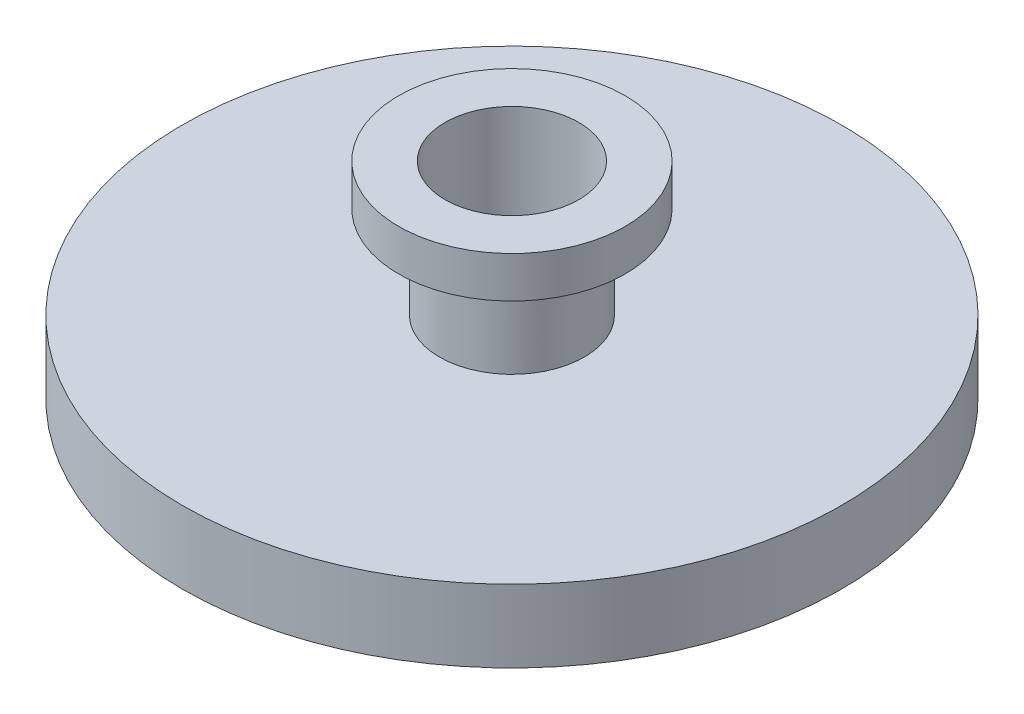
ISO-10303-21;
HEADER;
FILE_DESCRIPTION(('STEP AP214'),'2;1');
FILE_NAME('part.step','',(''),(''),'','','');
FILE_SCHEMA(('AUTOMOTIVE_DESIGN { 1 0 10303 214 1 1 1 1 }'));
ENDSEC;
DATA;
#1=APPLICATION_CONTEXT('core data for automotive mechanical design processes');
#2=APPLICATION_PROTOCOL_DEFINITION('international standard','automotive_design',2000,#1);
#3=PRODUCT_CONTEXT('',#1,'mechanical');
#4=PRODUCT('Part','Part','',(#3));
#5=PRODUCT_RELATED_PRODUCT_CATEGORY('part','',(#4));
#6=PRODUCT_DEFINITION_FORMATION('','',#4);
#7=PRODUCT_DEFINITION_CONTEXT('part definition',#1,'design');
#8=PRODUCT_DEFINITION('design','',#6,#7);
#9=PRODUCT_DEFINITION_SHAPE('','',#8);
#10=(LENGTH_UNIT() NAMED_UNIT(*) SI_UNIT(.MILLI.,.METRE.));
#11=(NAMED_UNIT(*) PLANE_ANGLE_UNIT() SI_UNIT($,.RADIAN.));
#12=(NAMED_UNIT(*) SI_UNIT($,.STERADIAN.) SOLID_ANGLE_UNIT());
#13=UNCERTAINTY_MEASURE_WITH_UNIT(LENGTH_MEASURE(1.E-05),#10,'distance_accuracy_value','');
#14=(GEOMETRIC_REPRESENTATION_CONTEXT(3) GLOBAL_UNCERTAINTY_ASSIGNED_CONTEXT((#13)) GLOBAL_UNIT_ASSIGNED_CONTEXT((#10,
#11,#12)) REPRESENTATION_CONTEXT('',''));
#15=CARTESIAN_POINT('',(0.,0.,0.));
#16=DIRECTION('',(0.,0.,1.));
#17=DIRECTION('',(1.,0.,0.));
#18=AXIS2_PLACEMENT_3D('',#15,#16,#17);
#19=CARTESIAN_POINT('',(0.,22.352,0.));
#20=DIRECTION('',(0.,-1.,0.));
#21=DIRECTION('',(0.,0.,-1.));
#22=AXIS2_PLACEMENT_3D('',#19,#20,#21);
#23=CYLINDRICAL_SURFACE('',#22,101.6);
#24=CARTESIAN_POINT('',(0.,22.352,0.));
#25=DIRECTION('',(0.,1.,0.));
#26=DIRECTION('',(0.,0.,1.));
#27=AXIS2_PLACEMENT_3D('',#24,#25,#26);
#28=CIRCLE('',#27,101.6);
#29=CARTESIAN_POINT('',(0.,22.352,101.6));
#30=VERTEX_POINT('',#29);
#31=EDGE_CURVE('E40',#30,#30,#28,.T.);
#32=ORIENTED_EDGE('',*,*,#31,.F.);
#33=EDGE_LOOP('',(#32));
#34=FACE_BOUND('',#33,.T.);
#35=CARTESIAN_POINT('',(0.,0.,0.));
#36=DIRECTION('',(0.,1.,0.));
#37=DIRECTION('',(0.,0.,1.));
#38=AXIS2_PLACEMENT_3D('',#35,#36,#37);
#39=CIRCLE('',#38,101.6);
#40=CARTESIAN_POINT('',(0.,0.,101.6));
#41=VERTEX_POINT('',#40);
#42=EDGE_CURVE('E44',#41,#41,#39,.T.);
#43=ORIENTED_EDGE('',*,*,#42,.T.);
#44=EDGE_LOOP('',(#43));
#45=FACE_BOUND('',#44,.T.);
#46=ADVANCED_FACE('F30',(#34,#45),#23,.T.);
#47=CARTESIAN_POINT('',(0.,22.352,0.));
#48=DIRECTION('',(0.,1.,0.));
#49=DIRECTION('',(0.,0.,1.));
#50=AXIS2_PLACEMENT_3D('',#47,#48,#49);
#51=PLANE('',#50);
#52=CARTESIAN_POINT('',(0.,22.352,0.));
#53=DIRECTION('',(0.,1.,0.));
#54=DIRECTION('',(0.,0.,1.));
#55=AXIS2_PLACEMENT_3D('',#52,#53,#54);
#56=CIRCLE('',#55,22.352);
#57=CARTESIAN_POINT('',(0.,22.352,22.352));
#58=VERTEX_POINT('',#57);
#59=EDGE_CURVE('E36',#58,#58,#56,.T.);
#60=ORIENTED_EDGE('',*,*,#59,.F.);
#61=EDGE_LOOP('',(#60));
#62=FACE_BOUND('',#61,.T.);
#63=ORIENTED_EDGE('',*,*,#31,.T.);
#64=EDGE_LOOP('',(#63));
#65=FACE_BOUND('',#64,.T.);
#66=ADVANCED_FACE('F92',(#62,#65),#51,.T.);
#67=CARTESIAN_POINT('',(0.,0.,0.));
#68=DIRECTION('',(0.,1.,0.));
#69=DIRECTION('',(0.,0.,1.));
#70=AXIS2_PLACEMENT_3D('',#67,#68,#69);
#71=PLANE('',#70);
#72=CARTESIAN_POINT('',(0.,0.,0.));
#73=DIRECTION('',(0.,1.,0.));
#74=DIRECTION('',(0.,0.,1.));
#75=AXIS2_PLACEMENT_3D('',#72,#73,#74);
#76=CIRCLE('',#75,20.6375);
#77=CARTESIAN_POINT('',(0.,0.,20.6375));
#78=VERTEX_POINT('',#77);
#79=EDGE_CURVE('E53',#78,#78,#76,.T.);
#80=ORIENTED_EDGE('',*,*,#79,.T.);
#81=EDGE_LOOP('',(#80));
#82=FACE_BOUND('',#81,.T.);
#83=ORIENTED_EDGE('',*,*,#42,.F.);
#84=EDGE_LOOP('',(#83));
#85=FACE_BOUND('',#84,.T.);
#86=ADVANCED_FACE('F62',(#82,#85),#71,.F.);
#87=CARTESIAN_POINT('',(0.,-40.8690030923268,0.));
#88=DIRECTION('',(0.,1.,0.));
#89=DIRECTION('',(0.,0.,1.));
#90=AXIS2_PLACEMENT_3D('',#87,#88,#89);
#91=CYLINDRICAL_SURFACE('',#90,22.352);
#92=CARTESIAN_POINT('',(0.,50.8,0.));
#93=DIRECTION('',(0.,-1.,0.));
#94=DIRECTION('',(0.,0.,-1.));
#95=AXIS2_PLACEMENT_3D('',#92,#93,#94);
#96=CIRCLE('',#95,22.352);
#97=CARTESIAN_POINT('',(0.,50.8,-22.352));
#98=VERTEX_POINT('',#97);
#99=EDGE_CURVE('E10',#98,#98,#96,.F.);
#100=ORIENTED_EDGE('',*,*,#99,.F.);
#101=EDGE_LOOP('',(#100));
#102=FACE_BOUND('',#101,.T.);
#103=ORIENTED_EDGE('',*,*,#59,.T.);
#104=EDGE_LOOP('',(#103));
#105=FACE_BOUND('',#104,.T.);
#106=ADVANCED_FACE('F80',(#102,#105),#91,.T.);
#107=CARTESIAN_POINT('',(0.,50.8,0.));
#108=DIRECTION('',(0.,1.,0.));
#109=DIRECTION('',(0.,0.,1.));
#110=AXIS2_PLACEMENT_3D('',#107,#108,#109);
#111=CYLINDRICAL_SURFACE('',#110,34.925);
#112=CARTESIAN_POINT('',(0.,50.8,0.));
#113=DIRECTION('',(0.,-1.,0.));
#114=DIRECTION('',(0.,0.,-1.));
#115=AXIS2_PLACEMENT_3D('',#112,#113,#114);
#116=CIRCLE('',#115,34.925);
#117=CARTESIAN_POINT('',(0.,50.8,-34.925));
#118=VERTEX_POINT('',#117);
#119=EDGE_CURVE('E48',#118,#118,#116,.T.);
#120=ORIENTED_EDGE('',*,*,#119,.F.);
#121=EDGE_LOOP('',(#120));
#122=FACE_BOUND('',#121,.T.);
#123=CARTESIAN_POINT('',(0.,63.5,0.));
#124=DIRECTION('',(0.,-1.,0.));
#125=DIRECTION('',(0.,0.,-1.));
#126=AXIS2_PLACEMENT_3D('',#123,#124,#125);
#127=CIRCLE('',#126,34.925);
#128=CARTESIAN_POINT('',(0.,63.5,-34.925));
#129=VERTEX_POINT('',#128);
#130=EDGE_CURVE('E50',#129,#129,#127,.T.);
#131=ORIENTED_EDGE('',*,*,#130,.T.);
#132=EDGE_LOOP('',(#131));
#133=FACE_BOUND('',#132,.T.);
#134=ADVANCED_FACE('F78',(#122,#133),#111,.T.);
#135=CARTESIAN_POINT('',(0.,50.8,0.));
#136=DIRECTION('',(0.,-1.,0.));
#137=DIRECTION('',(0.,0.,-1.));
#138=AXIS2_PLACEMENT_3D('',#135,#136,#137);
#139=PLANE('',#138);
#140=ORIENTED_EDGE('',*,*,#99,.T.);
#141=EDGE_LOOP('',(#140));
#142=FACE_BOUND('',#141,.T.);
#143=ORIENTED_EDGE('',*,*,#119,.T.);
#144=EDGE_LOOP('',(#143));
#145=FACE_BOUND('',#144,.T.);
#146=ADVANCED_FACE('F74',(#142,#145),#139,.T.);
#147=CARTESIAN_POINT('',(0.,63.5,0.));
#148=DIRECTION('',(0.,1.,0.));
#149=DIRECTION('',(0.,0.,1.));
#150=AXIS2_PLACEMENT_3D('',#147,#148,#149);
#151=PLANE('',#150);
#152=CARTESIAN_POINT('',(0.,63.5,0.));
#153=DIRECTION('',(0.,1.,0.));
#154=DIRECTION('',(0.,0.,1.));
#155=AXIS2_PLACEMENT_3D('',#152,#153,#154);
#156=CIRCLE('',#155,20.6375);
#157=CARTESIAN_POINT('',(0.,63.5,20.6375));
#158=VERTEX_POINT('',#157);
#159=EDGE_CURVE('E56',#158,#158,#156,.T.);
#160=ORIENTED_EDGE('',*,*,#159,.F.);
#161=EDGE_LOOP('',(#160));
#162=FACE_BOUND('',#161,.T.);
#163=ORIENTED_EDGE('',*,*,#130,.F.);
#164=EDGE_LOOP('',(#163));
#165=FACE_BOUND('',#164,.T.);
#166=ADVANCED_FACE('F68',(#162,#165),#151,.T.);
#167=CARTESIAN_POINT('',(0.,0.,0.));
#168=DIRECTION('',(0.,1.,0.));
#169=DIRECTION('',(0.,0.,1.));
#170=AXIS2_PLACEMENT_3D('',#167,#168,#169);
#171=CYLINDRICAL_SURFACE('',#170,20.6375);
#172=ORIENTED_EDGE('',*,*,#79,.F.);
#173=EDGE_LOOP('',(#172));
#174=FACE_BOUND('',#173,.T.);
#175=ORIENTED_EDGE('',*,*,#159,.T.);
#176=EDGE_LOOP('',(#175));
#177=FACE_BOUND('',#176,.T.);
#178=ADVANCED_FACE('F65',(#174,#177),#171,.F.);
#179=CLOSED_SHELL('',(#46,#66,#86,#106,#134,#146,#166,#178));
#180=MANIFOLD_SOLID_BREP('B2',#179);
#181=ADVANCED_BREP_SHAPE_REPRESENTATION('',(#18,#180),#14);
#182=SHAPE_DEFINITION_REPRESENTATION(#9,#181);
ENDSEC;
END-ISO-10303-21;
